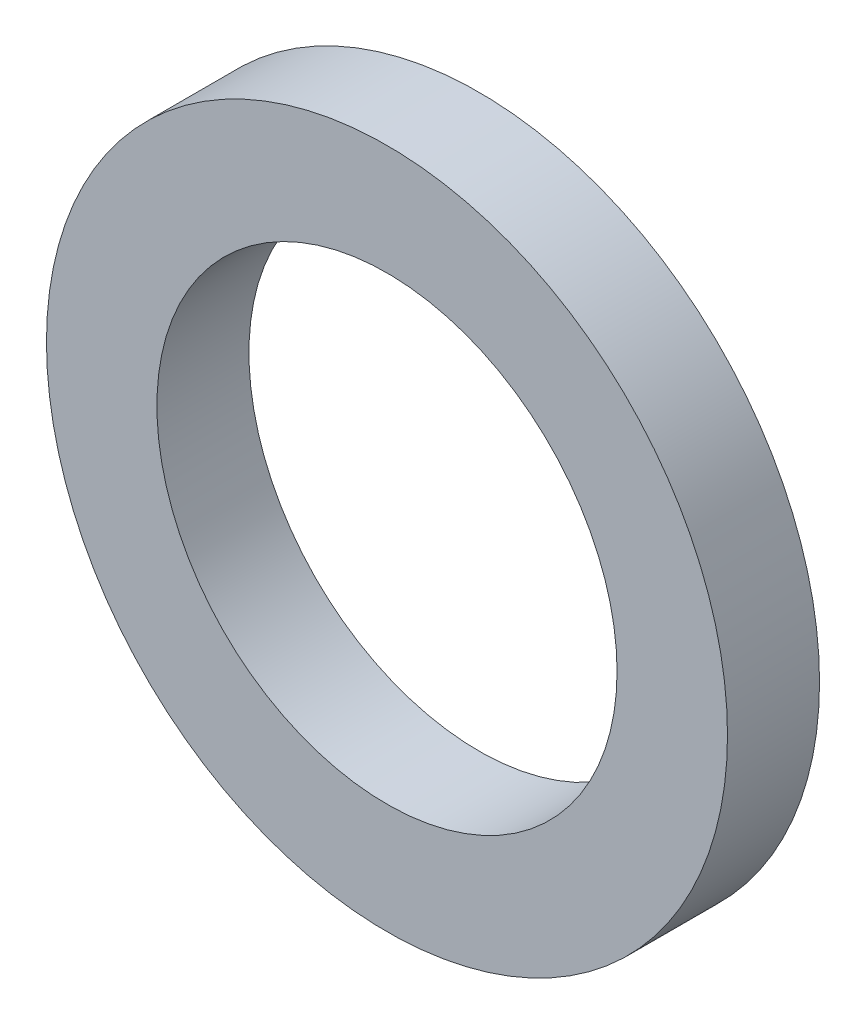
ISO-10303-21;
HEADER;
FILE_DESCRIPTION(('STEP AP214'),'2;1');
FILE_NAME('part.step','',(''),(''),'','','');
FILE_SCHEMA(('AUTOMOTIVE_DESIGN { 1 0 10303 214 1 1 1 1 }'));
ENDSEC;
DATA;
#1=APPLICATION_CONTEXT('core data for automotive mechanical design processes');
#2=APPLICATION_PROTOCOL_DEFINITION('international standard','automotive_design',2000,#1);
#3=PRODUCT_CONTEXT('',#1,'mechanical');
#4=PRODUCT('Part','Part','',(#3));
#5=PRODUCT_RELATED_PRODUCT_CATEGORY('part','',(#4));
#6=PRODUCT_DEFINITION_FORMATION('','',#4);
#7=PRODUCT_DEFINITION_CONTEXT('part definition',#1,'design');
#8=PRODUCT_DEFINITION('design','',#6,#7);
#9=PRODUCT_DEFINITION_SHAPE('','',#8);
#10=(LENGTH_UNIT() NAMED_UNIT(*) SI_UNIT(.MILLI.,.METRE.));
#11=(NAMED_UNIT(*) PLANE_ANGLE_UNIT() SI_UNIT($,.RADIAN.));
#12=(NAMED_UNIT(*) SI_UNIT($,.STERADIAN.) SOLID_ANGLE_UNIT());
#13=UNCERTAINTY_MEASURE_WITH_UNIT(LENGTH_MEASURE(1.E-05),#10,'distance_accuracy_value','');
#14=(GEOMETRIC_REPRESENTATION_CONTEXT(3) GLOBAL_UNCERTAINTY_ASSIGNED_CONTEXT((#13)) GLOBAL_UNIT_ASSIGNED_CONTEXT((#10,
#11,#12)) REPRESENTATION_CONTEXT('',''));
#15=CARTESIAN_POINT('',(0.,0.,0.));
#16=DIRECTION('',(0.,0.,1.));
#17=DIRECTION('',(1.,0.,0.));
#18=AXIS2_PLACEMENT_3D('',#15,#16,#17);
#19=CARTESIAN_POINT('',(0.,0.,5.));
#20=DIRECTION('',(0.,0.,1.));
#21=DIRECTION('',(1.,0.,0.));
#22=AXIS2_PLACEMENT_3D('',#19,#20,#21);
#23=PLANE('',#22);
#24=CARTESIAN_POINT('',(0.,0.,5.));
#25=DIRECTION('',(0.,0.,1.));
#26=DIRECTION('',(1.,0.,0.));
#27=AXIS2_PLACEMENT_3D('',#24,#25,#26);
#28=CIRCLE('',#27,18.5);
#29=CARTESIAN_POINT('',(18.5,0.,5.));
#30=VERTEX_POINT('',#29);
#31=EDGE_CURVE('E10',#30,#30,#28,.T.);
#32=ORIENTED_EDGE('',*,*,#31,.T.);
#33=EDGE_LOOP('',(#32));
#34=FACE_BOUND('',#33,.T.);
#35=CARTESIAN_POINT('',(0.,0.,5.));
#36=DIRECTION('',(0.,0.,1.));
#37=DIRECTION('',(1.,0.,0.));
#38=AXIS2_PLACEMENT_3D('',#35,#36,#37);
#39=CIRCLE('',#38,12.5);
#40=CARTESIAN_POINT('',(12.5,0.,5.));
#41=VERTEX_POINT('',#40);
#42=EDGE_CURVE('E44',#41,#41,#39,.T.);
#43=ORIENTED_EDGE('',*,*,#42,.F.);
#44=EDGE_LOOP('',(#43));
#45=FACE_BOUND('',#44,.T.);
#46=ADVANCED_FACE('F33',(#34,#45),#23,.T.);
#47=CARTESIAN_POINT('',(0.,0.,0.));
#48=DIRECTION('',(0.,0.,1.));
#49=DIRECTION('',(1.,0.,0.));
#50=AXIS2_PLACEMENT_3D('',#47,#48,#49);
#51=PLANE('',#50);
#52=CARTESIAN_POINT('',(0.,0.,0.));
#53=DIRECTION('',(0.,0.,1.));
#54=DIRECTION('',(1.,0.,0.));
#55=AXIS2_PLACEMENT_3D('',#52,#53,#54);
#56=CIRCLE('',#55,18.5);
#57=CARTESIAN_POINT('',(18.5,0.,0.));
#58=VERTEX_POINT('',#57);
#59=EDGE_CURVE('E37',#58,#58,#56,.T.);
#60=ORIENTED_EDGE('',*,*,#59,.F.);
#61=EDGE_LOOP('',(#60));
#62=FACE_BOUND('',#61,.T.);
#63=CARTESIAN_POINT('',(0.,0.,0.));
#64=DIRECTION('',(0.,0.,1.));
#65=DIRECTION('',(1.,0.,0.));
#66=AXIS2_PLACEMENT_3D('',#63,#64,#65);
#67=CIRCLE('',#66,12.5);
#68=CARTESIAN_POINT('',(12.5,0.,0.));
#69=VERTEX_POINT('',#68);
#70=EDGE_CURVE('E46',#69,#69,#67,.T.);
#71=ORIENTED_EDGE('',*,*,#70,.T.);
#72=EDGE_LOOP('',(#71));
#73=FACE_BOUND('',#72,.T.);
#74=ADVANCED_FACE('F56',(#62,#73),#51,.F.);
#75=CARTESIAN_POINT('',(0.,0.,5.));
#76=DIRECTION('',(0.,0.,-1.));
#77=DIRECTION('',(-1.,0.,0.));
#78=AXIS2_PLACEMENT_3D('',#75,#76,#77);
#79=CYLINDRICAL_SURFACE('',#78,18.5);
#80=ORIENTED_EDGE('',*,*,#31,.F.);
#81=EDGE_LOOP('',(#80));
#82=FACE_BOUND('',#81,.T.);
#83=ORIENTED_EDGE('',*,*,#59,.T.);
#84=EDGE_LOOP('',(#83));
#85=FACE_BOUND('',#84,.T.);
#86=ADVANCED_FACE('F35',(#82,#85),#79,.T.);
#87=CARTESIAN_POINT('',(0.,0.,5.));
#88=DIRECTION('',(0.,0.,-1.));
#89=DIRECTION('',(-1.,0.,0.));
#90=AXIS2_PLACEMENT_3D('',#87,#88,#89);
#91=CYLINDRICAL_SURFACE('',#90,12.5);
#92=ORIENTED_EDGE('',*,*,#42,.T.);
#93=EDGE_LOOP('',(#92));
#94=FACE_BOUND('',#93,.T.);
#95=ORIENTED_EDGE('',*,*,#70,.F.);
#96=EDGE_LOOP('',(#95));
#97=FACE_BOUND('',#96,.T.);
#98=ADVANCED_FACE('F52',(#94,#97),#91,.F.);
#99=CLOSED_SHELL('',(#46,#74,#86,#98));
#100=MANIFOLD_SOLID_BREP('B2',#99);
#101=ADVANCED_BREP_SHAPE_REPRESENTATION('',(#18,#100),#14);
#102=SHAPE_DEFINITION_REPRESENTATION(#9,#101);
ENDSEC;
END-ISO-10303-21;
